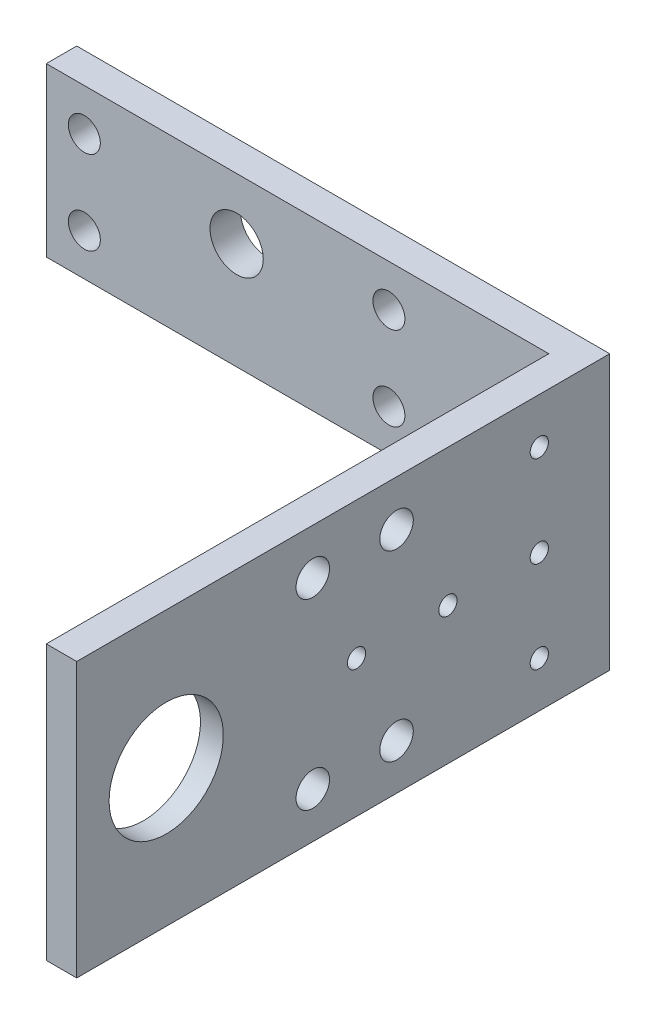
ISO-10303-21;
HEADER;
FILE_DESCRIPTION(('STEP AP214'),'2;1');
FILE_NAME('part.step','',(''),(''),'','','');
FILE_SCHEMA(('AUTOMOTIVE_DESIGN { 1 0 10303 214 1 1 1 1 }'));
ENDSEC;
DATA;
#1=APPLICATION_CONTEXT('core data for automotive mechanical design processes');
#2=APPLICATION_PROTOCOL_DEFINITION('international standard','automotive_design',2000,#1);
#3=PRODUCT_CONTEXT('',#1,'mechanical');
#4=PRODUCT('Part','Part','',(#3));
#5=PRODUCT_RELATED_PRODUCT_CATEGORY('part','',(#4));
#6=PRODUCT_DEFINITION_FORMATION('','',#4);
#7=PRODUCT_DEFINITION_CONTEXT('part definition',#1,'design');
#8=PRODUCT_DEFINITION('design','',#6,#7);
#9=PRODUCT_DEFINITION_SHAPE('','',#8);
#10=(LENGTH_UNIT() NAMED_UNIT(*) SI_UNIT(.MILLI.,.METRE.));
#11=(NAMED_UNIT(*) PLANE_ANGLE_UNIT() SI_UNIT($,.RADIAN.));
#12=(NAMED_UNIT(*) SI_UNIT($,.STERADIAN.) SOLID_ANGLE_UNIT());
#13=UNCERTAINTY_MEASURE_WITH_UNIT(LENGTH_MEASURE(1.E-05),#10,'distance_accuracy_value','');
#14=(GEOMETRIC_REPRESENTATION_CONTEXT(3) GLOBAL_UNCERTAINTY_ASSIGNED_CONTEXT((#13)) GLOBAL_UNIT_ASSIGNED_CONTEXT((#10,
#11,#12)) REPRESENTATION_CONTEXT('',''));
#15=CARTESIAN_POINT('',(0.,0.,0.));
#16=DIRECTION('',(0.,0.,1.));
#17=DIRECTION('',(1.,0.,0.));
#18=AXIS2_PLACEMENT_3D('',#15,#16,#17);
#19=CARTESIAN_POINT('',(35.,18.,23.25));
#20=DIRECTION('',(-1.,0.,0.));
#21=DIRECTION('',(0.,0.,1.));
#22=AXIS2_PLACEMENT_3D('',#19,#20,#21);
#23=CYLINDRICAL_SURFACE('',#22,7.5);
#24=CARTESIAN_POINT('',(35.,18.,23.25));
#25=DIRECTION('',(-1.,0.,0.));
#26=DIRECTION('',(0.,0.,1.));
#27=AXIS2_PLACEMENT_3D('',#24,#25,#26);
#28=CIRCLE('',#27,7.5);
#29=CARTESIAN_POINT('',(35.,18.,30.75));
#30=VERTEX_POINT('',#29);
#31=EDGE_CURVE('E293',#30,#30,#28,.T.);
#32=ORIENTED_EDGE('',*,*,#31,.F.);
#33=EDGE_LOOP('',(#32));
#34=FACE_BOUND('',#33,.T.);
#35=CARTESIAN_POINT('',(32.,18.,23.25));
#36=DIRECTION('',(-1.,0.,0.));
#37=DIRECTION('',(0.,0.,1.));
#38=AXIS2_PLACEMENT_3D('',#35,#36,#37);
#39=CIRCLE('',#38,7.5);
#40=CARTESIAN_POINT('',(32.,18.,30.75));
#41=VERTEX_POINT('',#40);
#42=EDGE_CURVE('E21',#41,#41,#39,.F.);
#43=ORIENTED_EDGE('',*,*,#42,.F.);
#44=EDGE_LOOP('',(#43));
#45=FACE_BOUND('',#44,.T.);
#46=ADVANCED_FACE('F17',(#34,#45),#23,.F.);
#47=CARTESIAN_POINT('',(-35.,36.,-31.));
#48=DIRECTION('',(1.,0.,0.));
#49=DIRECTION('',(0.,0.,-1.));
#50=AXIS2_PLACEMENT_3D('',#47,#48,#49);
#51=PLANE('',#50);
#52=DIRECTION('',(0.,-1.,0.));
#53=VECTOR('',#52,1.);
#54=CARTESIAN_POINT('',(-35.,36.,-35.));
#55=LINE('',#54,#53);
#56=CARTESIAN_POINT('',(-35.,36.,-35.));
#57=VERTEX_POINT('',#56);
#58=CARTESIAN_POINT('',(-35.,14.,-35.));
#59=VERTEX_POINT('',#58);
#60=EDGE_CURVE('E124',#57,#59,#55,.T.);
#61=ORIENTED_EDGE('',*,*,#60,.T.);
#62=DIRECTION('',(0.,0.,-1.));
#63=VECTOR('',#62,1.);
#64=CARTESIAN_POINT('',(-35.,14.,35.));
#65=LINE('',#64,#63);
#66=CARTESIAN_POINT('',(-35.,14.,-31.));
#67=VERTEX_POINT('',#66);
#68=EDGE_CURVE('E170',#67,#59,#65,.T.);
#69=ORIENTED_EDGE('',*,*,#68,.F.);
#70=DIRECTION('',(0.,-1.,0.));
#71=VECTOR('',#70,1.);
#72=CARTESIAN_POINT('',(-35.,36.,-31.));
#73=LINE('',#72,#71);
#74=CARTESIAN_POINT('',(-35.,36.,-31.));
#75=VERTEX_POINT('',#74);
#76=EDGE_CURVE('E27',#75,#67,#73,.T.);
#77=ORIENTED_EDGE('',*,*,#76,.F.);
#78=DIRECTION('',(0.,0.,1.));
#79=VECTOR('',#78,1.);
#80=CARTESIAN_POINT('',(-35.,36.,-31.));
#81=LINE('',#80,#79);
#82=EDGE_CURVE('E143',#57,#75,#81,.T.);
#83=ORIENTED_EDGE('',*,*,#82,.F.);
#84=EDGE_LOOP('',(#61,#69,#77,#83));
#85=FACE_BOUND('',#84,.T.);
#86=ADVANCED_FACE('F19',(#85),#51,.F.);
#87=CARTESIAN_POINT('',(31.,36.,-31.));
#88=DIRECTION('',(0.,0.,-1.));
#89=DIRECTION('',(-1.,0.,0.));
#90=AXIS2_PLACEMENT_3D('',#87,#88,#89);
#91=PLANE('',#90);
#92=CARTESIAN_POINT('',(-10.,28.,-31.));
#93=DIRECTION('',(0.,0.,1.));
#94=DIRECTION('',(1.,0.,0.));
#95=AXIS2_PLACEMENT_3D('',#92,#93,#94);
#96=CIRCLE('',#95,3.5);
#97=CARTESIAN_POINT('',(-6.5,28.,-31.));
#98=VERTEX_POINT('',#97);
#99=EDGE_CURVE('E341',#98,#98,#96,.T.);
#100=ORIENTED_EDGE('',*,*,#99,.F.);
#101=EDGE_LOOP('',(#100));
#102=FACE_BOUND('',#101,.T.);
#103=CARTESIAN_POINT('',(10.,19.5,-31.));
#104=DIRECTION('',(0.,0.,-1.));
#105=DIRECTION('',(-1.,0.,0.));
#106=AXIS2_PLACEMENT_3D('',#103,#104,#105);
#107=CIRCLE('',#106,2.1);
#108=CARTESIAN_POINT('',(7.9,19.5,-31.));
#109=VERTEX_POINT('',#108);
#110=EDGE_CURVE('E194',#109,#109,#107,.T.);
#111=ORIENTED_EDGE('',*,*,#110,.T.);
#112=EDGE_LOOP('',(#111));
#113=FACE_BOUND('',#112,.T.);
#114=CARTESIAN_POINT('',(10.,30.5,-31.));
#115=DIRECTION('',(0.,0.,-1.));
#116=DIRECTION('',(-1.,0.,0.));
#117=AXIS2_PLACEMENT_3D('',#114,#115,#116);
#118=CIRCLE('',#117,2.1);
#119=CARTESIAN_POINT('',(7.9,30.5,-31.));
#120=VERTEX_POINT('',#119);
#121=EDGE_CURVE('E202',#120,#120,#118,.T.);
#122=ORIENTED_EDGE('',*,*,#121,.T.);
#123=EDGE_LOOP('',(#122));
#124=FACE_BOUND('',#123,.T.);
#125=CARTESIAN_POINT('',(-30.,19.5,-31.));
#126=DIRECTION('',(0.,0.,-1.));
#127=DIRECTION('',(-1.,0.,0.));
#128=AXIS2_PLACEMENT_3D('',#125,#126,#127);
#129=CIRCLE('',#128,2.1);
#130=CARTESIAN_POINT('',(-32.1,19.5,-31.));
#131=VERTEX_POINT('',#130);
#132=EDGE_CURVE('E210',#131,#131,#129,.T.);
#133=ORIENTED_EDGE('',*,*,#132,.T.);
#134=EDGE_LOOP('',(#133));
#135=FACE_BOUND('',#134,.T.);
#136=CARTESIAN_POINT('',(-30.,30.5,-31.));
#137=DIRECTION('',(0.,0.,-1.));
#138=DIRECTION('',(-1.,0.,0.));
#139=AXIS2_PLACEMENT_3D('',#136,#137,#138);
#140=CIRCLE('',#139,2.1);
#141=CARTESIAN_POINT('',(-32.1,30.5,-31.));
#142=VERTEX_POINT('',#141);
#143=EDGE_CURVE('E132',#142,#142,#140,.T.);
#144=ORIENTED_EDGE('',*,*,#143,.T.);
#145=EDGE_LOOP('',(#144));
#146=FACE_BOUND('',#145,.T.);
#147=DIRECTION('',(1.,0.,0.));
#148=VECTOR('',#147,1.);
#149=CARTESIAN_POINT('',(31.,14.,-31.));
#150=LINE('',#149,#148);
#151=CARTESIAN_POINT('',(19.,14.,-31.));
#152=VERTEX_POINT('',#151);
#153=EDGE_CURVE('E163',#67,#152,#150,.T.);
#154=ORIENTED_EDGE('',*,*,#153,.T.);
#155=DIRECTION('',(0.581238193719097,-0.813733471206735,0.));
#156=VECTOR('',#155,1.);
#157=CARTESIAN_POINT('',(12.6486486486487,22.8918918918919,-31.));
#158=LINE('',#157,#156);
#159=CARTESIAN_POINT('',(29.,0.,-31.));
#160=VERTEX_POINT('',#159);
#161=EDGE_CURVE('E181',#152,#160,#158,.T.);
#162=ORIENTED_EDGE('',*,*,#161,.T.);
#163=DIRECTION('',(1.,0.,0.));
#164=VECTOR('',#163,1.);
#165=CARTESIAN_POINT('',(31.,0.,-31.));
#166=LINE('',#165,#164);
#167=CARTESIAN_POINT('',(31.,0.,-31.));
#168=VERTEX_POINT('',#167);
#169=EDGE_CURVE('E128',#160,#168,#166,.T.);
#170=ORIENTED_EDGE('',*,*,#169,.T.);
#171=DIRECTION('',(0.,-1.,0.));
#172=VECTOR('',#171,1.);
#173=CARTESIAN_POINT('',(31.,36.,-31.));
#174=LINE('',#173,#172);
#175=CARTESIAN_POINT('',(31.,36.,-31.));
#176=VERTEX_POINT('',#175);
#177=EDGE_CURVE('E151',#176,#168,#174,.T.);
#178=ORIENTED_EDGE('',*,*,#177,.F.);
#179=DIRECTION('',(1.,0.,0.));
#180=VECTOR('',#179,1.);
#181=CARTESIAN_POINT('',(-31.,36.,-31.));
#182=LINE('',#181,#180);
#183=EDGE_CURVE('E87',#75,#176,#182,.T.);
#184=ORIENTED_EDGE('',*,*,#183,.F.);
#185=ORIENTED_EDGE('',*,*,#76,.T.);
#186=EDGE_LOOP('',(#154,#162,#170,#178,#184,#185));
#187=FACE_BOUND('',#186,.T.);
#188=ADVANCED_FACE('F159',(#102,#113,#124,#135,#146,#187),#91,.F.);
#189=CARTESIAN_POINT('',(31.,36.,31.));
#190=DIRECTION('',(1.,0.,0.));
#191=DIRECTION('',(0.,0.,-1.));
#192=AXIS2_PLACEMENT_3D('',#189,#190,#191);
#193=PLANE('',#192);
#194=CARTESIAN_POINT('',(31.,18.,23.25));
#195=DIRECTION('',(-1.,0.,0.));
#196=DIRECTION('',(0.,0.,1.));
#197=AXIS2_PLACEMENT_3D('',#194,#195,#196);
#198=CIRCLE('',#197,9.);
#199=CARTESIAN_POINT('',(31.,18.,32.25));
#200=VERTEX_POINT('',#199);
#201=EDGE_CURVE('E348',#200,#200,#198,.T.);
#202=ORIENTED_EDGE('',*,*,#201,.F.);
#203=EDGE_LOOP('',(#202));
#204=FACE_BOUND('',#203,.T.);
#205=CARTESIAN_POINT('',(31.,6.,-25.75));
#206=DIRECTION('',(1.,0.,0.));
#207=DIRECTION('',(0.,0.,-1.));
#208=AXIS2_PLACEMENT_3D('',#205,#206,#207);
#209=CIRCLE('',#208,1.2);
#210=CARTESIAN_POINT('',(31.,6.,-26.95));
#211=VERTEX_POINT('',#210);
#212=EDGE_CURVE('E332',#211,#211,#209,.T.);
#213=ORIENTED_EDGE('',*,*,#212,.T.);
#214=EDGE_LOOP('',(#213));
#215=FACE_BOUND('',#214,.T.);
#216=CARTESIAN_POINT('',(31.,30.,-25.75));
#217=DIRECTION('',(1.,0.,0.));
#218=DIRECTION('',(0.,0.,-1.));
#219=AXIS2_PLACEMENT_3D('',#216,#217,#218);
#220=CIRCLE('',#219,1.2);
#221=CARTESIAN_POINT('',(31.,30.,-26.95));
#222=VERTEX_POINT('',#221);
#223=EDGE_CURVE('E324',#222,#222,#220,.T.);
#224=ORIENTED_EDGE('',*,*,#223,.T.);
#225=EDGE_LOOP('',(#224));
#226=FACE_BOUND('',#225,.T.);
#227=CARTESIAN_POINT('',(31.,18.,-25.75));
#228=DIRECTION('',(1.,0.,0.));
#229=DIRECTION('',(0.,0.,-1.));
#230=AXIS2_PLACEMENT_3D('',#227,#228,#229);
#231=CIRCLE('',#230,1.2);
#232=CARTESIAN_POINT('',(31.,18.,-26.95));
#233=VERTEX_POINT('',#232);
#234=EDGE_CURVE('E316',#233,#233,#231,.T.);
#235=ORIENTED_EDGE('',*,*,#234,.T.);
#236=EDGE_LOOP('',(#235));
#237=FACE_BOUND('',#236,.T.);
#238=CARTESIAN_POINT('',(31.,18.,-13.75));
#239=DIRECTION('',(1.,0.,0.));
#240=DIRECTION('',(0.,0.,-1.));
#241=AXIS2_PLACEMENT_3D('',#238,#239,#240);
#242=CIRCLE('',#241,1.2);
#243=CARTESIAN_POINT('',(31.,18.,-14.95));
#244=VERTEX_POINT('',#243);
#245=EDGE_CURVE('E308',#244,#244,#242,.T.);
#246=ORIENTED_EDGE('',*,*,#245,.T.);
#247=EDGE_LOOP('',(#246));
#248=FACE_BOUND('',#247,.T.);
#249=CARTESIAN_POINT('',(31.,18.,-1.75));
#250=DIRECTION('',(1.,0.,0.));
#251=DIRECTION('',(0.,0.,-1.));
#252=AXIS2_PLACEMENT_3D('',#249,#250,#251);
#253=CIRCLE('',#252,1.2);
#254=CARTESIAN_POINT('',(31.,18.,-2.95));
#255=VERTEX_POINT('',#254);
#256=EDGE_CURVE('E300',#255,#255,#253,.T.);
#257=ORIENTED_EDGE('',*,*,#256,.T.);
#258=EDGE_LOOP('',(#257));
#259=FACE_BOUND('',#258,.T.);
#260=CARTESIAN_POINT('',(31.,6.,4.));
#261=DIRECTION('',(-1.,0.,0.));
#262=DIRECTION('',(0.,0.,1.));
#263=AXIS2_PLACEMENT_3D('',#260,#261,#262);
#264=CIRCLE('',#263,2.2);
#265=CARTESIAN_POINT('',(31.,6.,6.2));
#266=VERTEX_POINT('',#265);
#267=EDGE_CURVE('E289',#266,#266,#264,.T.);
#268=ORIENTED_EDGE('',*,*,#267,.F.);
#269=EDGE_LOOP('',(#268));
#270=FACE_BOUND('',#269,.T.);
#271=CARTESIAN_POINT('',(31.,6.,-7.));
#272=DIRECTION('',(-1.,0.,0.));
#273=DIRECTION('',(0.,0.,1.));
#274=AXIS2_PLACEMENT_3D('',#271,#272,#273);
#275=CIRCLE('',#274,2.2);
#276=CARTESIAN_POINT('',(31.,6.,-4.8));
#277=VERTEX_POINT('',#276);
#278=EDGE_CURVE('E281',#277,#277,#275,.T.);
#279=ORIENTED_EDGE('',*,*,#278,.F.);
#280=EDGE_LOOP('',(#279));
#281=FACE_BOUND('',#280,.T.);
#282=CARTESIAN_POINT('',(31.,30.,4.));
#283=DIRECTION('',(-1.,0.,0.));
#284=DIRECTION('',(0.,0.,1.));
#285=AXIS2_PLACEMENT_3D('',#282,#283,#284);
#286=CIRCLE('',#285,2.2);
#287=CARTESIAN_POINT('',(31.,30.,6.2));
#288=VERTEX_POINT('',#287);
#289=EDGE_CURVE('E273',#288,#288,#286,.T.);
#290=ORIENTED_EDGE('',*,*,#289,.F.);
#291=EDGE_LOOP('',(#290));
#292=FACE_BOUND('',#291,.T.);
#293=CARTESIAN_POINT('',(31.,30.,-7.));
#294=DIRECTION('',(-1.,0.,0.));
#295=DIRECTION('',(0.,0.,1.));
#296=AXIS2_PLACEMENT_3D('',#293,#294,#295);
#297=CIRCLE('',#296,2.2);
#298=CARTESIAN_POINT('',(31.,30.,-4.8));
#299=VERTEX_POINT('',#298);
#300=EDGE_CURVE('E266',#299,#299,#297,.T.);
#301=ORIENTED_EDGE('',*,*,#300,.F.);
#302=EDGE_LOOP('',(#301));
#303=FACE_BOUND('',#302,.T.);
#304=DIRECTION('',(0.,0.,1.));
#305=VECTOR('',#304,1.);
#306=CARTESIAN_POINT('',(31.,0.,31.));
#307=LINE('',#306,#305);
#308=CARTESIAN_POINT('',(31.,0.,35.));
#309=VERTEX_POINT('',#308);
#310=EDGE_CURVE('E131',#168,#309,#307,.T.);
#311=ORIENTED_EDGE('',*,*,#310,.T.);
#312=DIRECTION('',(0.,-1.,0.));
#313=VECTOR('',#312,1.);
#314=CARTESIAN_POINT('',(31.,36.,35.));
#315=LINE('',#314,#313);
#316=CARTESIAN_POINT('',(31.,36.,35.));
#317=VERTEX_POINT('',#316);
#318=EDGE_CURVE('E116',#317,#309,#315,.T.);
#319=ORIENTED_EDGE('',*,*,#318,.F.);
#320=DIRECTION('',(0.,0.,1.));
#321=VECTOR('',#320,1.);
#322=CARTESIAN_POINT('',(31.,36.,31.));
#323=LINE('',#322,#321);
#324=EDGE_CURVE('E105',#176,#317,#323,.T.);
#325=ORIENTED_EDGE('',*,*,#324,.F.);
#326=ORIENTED_EDGE('',*,*,#177,.T.);
#327=EDGE_LOOP('',(#311,#319,#325,#326));
#328=FACE_BOUND('',#327,.T.);
#329=ADVANCED_FACE('F250',(#204,#215,#226,#237,#248,#259,#270,#281,#292,#303,#328),#193,.F.);
#330=CARTESIAN_POINT('',(31.,36.,35.));
#331=DIRECTION('',(0.,0.,-1.));
#332=DIRECTION('',(-1.,0.,0.));
#333=AXIS2_PLACEMENT_3D('',#330,#331,#332);
#334=PLANE('',#333);
#335=DIRECTION('',(1.,0.,0.));
#336=VECTOR('',#335,1.);
#337=CARTESIAN_POINT('',(31.,0.,35.));
#338=LINE('',#337,#336);
#339=CARTESIAN_POINT('',(35.,0.,35.));
#340=VERTEX_POINT('',#339);
#341=EDGE_CURVE('E114',#309,#340,#338,.T.);
#342=ORIENTED_EDGE('',*,*,#341,.T.);
#343=DIRECTION('',(0.,-1.,0.));
#344=VECTOR('',#343,1.);
#345=CARTESIAN_POINT('',(35.,36.,35.));
#346=LINE('',#345,#344);
#347=CARTESIAN_POINT('',(35.,36.,35.));
#348=VERTEX_POINT('',#347);
#349=EDGE_CURVE('E111',#348,#340,#346,.T.);
#350=ORIENTED_EDGE('',*,*,#349,.F.);
#351=DIRECTION('',(1.,0.,0.));
#352=VECTOR('',#351,1.);
#353=CARTESIAN_POINT('',(31.,36.,35.));
#354=LINE('',#353,#352);
#355=EDGE_CURVE('E99',#317,#348,#354,.T.);
#356=ORIENTED_EDGE('',*,*,#355,.F.);
#357=ORIENTED_EDGE('',*,*,#318,.T.);
#358=EDGE_LOOP('',(#342,#350,#356,#357));
#359=FACE_BOUND('',#358,.T.);
#360=ADVANCED_FACE('F112',(#359),#334,.F.);
#361=CARTESIAN_POINT('',(35.,36.,35.));
#362=DIRECTION('',(-1.,0.,0.));
#363=DIRECTION('',(0.,0.,1.));
#364=AXIS2_PLACEMENT_3D('',#361,#362,#363);
#365=PLANE('',#364);
#366=CARTESIAN_POINT('',(35.,6.,-25.75));
#367=DIRECTION('',(1.,0.,0.));
#368=DIRECTION('',(0.,0.,-1.));
#369=AXIS2_PLACEMENT_3D('',#366,#367,#368);
#370=CIRCLE('',#369,1.2);
#371=CARTESIAN_POINT('',(35.,6.,-26.95));
#372=VERTEX_POINT('',#371);
#373=EDGE_CURVE('E336',#372,#372,#370,.T.);
#374=ORIENTED_EDGE('',*,*,#373,.F.);
#375=EDGE_LOOP('',(#374));
#376=FACE_BOUND('',#375,.T.);
#377=CARTESIAN_POINT('',(35.,30.,-25.75));
#378=DIRECTION('',(1.,0.,0.));
#379=DIRECTION('',(0.,0.,-1.));
#380=AXIS2_PLACEMENT_3D('',#377,#378,#379);
#381=CIRCLE('',#380,1.2);
#382=CARTESIAN_POINT('',(35.,30.,-26.95));
#383=VERTEX_POINT('',#382);
#384=EDGE_CURVE('E328',#383,#383,#381,.T.);
#385=ORIENTED_EDGE('',*,*,#384,.F.);
#386=EDGE_LOOP('',(#385));
#387=FACE_BOUND('',#386,.T.);
#388=CARTESIAN_POINT('',(35.,18.,-25.75));
#389=DIRECTION('',(1.,0.,0.));
#390=DIRECTION('',(0.,0.,-1.));
#391=AXIS2_PLACEMENT_3D('',#388,#389,#390);
#392=CIRCLE('',#391,1.2);
#393=CARTESIAN_POINT('',(35.,18.,-26.95));
#394=VERTEX_POINT('',#393);
#395=EDGE_CURVE('E320',#394,#394,#392,.T.);
#396=ORIENTED_EDGE('',*,*,#395,.F.);
#397=EDGE_LOOP('',(#396));
#398=FACE_BOUND('',#397,.T.);
#399=CARTESIAN_POINT('',(35.,18.,-13.75));
#400=DIRECTION('',(1.,0.,0.));
#401=DIRECTION('',(0.,0.,-1.));
#402=AXIS2_PLACEMENT_3D('',#399,#400,#401);
#403=CIRCLE('',#402,1.2);
#404=CARTESIAN_POINT('',(35.,18.,-14.95));
#405=VERTEX_POINT('',#404);
#406=EDGE_CURVE('E312',#405,#405,#403,.T.);
#407=ORIENTED_EDGE('',*,*,#406,.F.);
#408=EDGE_LOOP('',(#407));
#409=FACE_BOUND('',#408,.T.);
#410=CARTESIAN_POINT('',(35.,18.,-1.75));
#411=DIRECTION('',(1.,0.,0.));
#412=DIRECTION('',(0.,0.,-1.));
#413=AXIS2_PLACEMENT_3D('',#410,#411,#412);
#414=CIRCLE('',#413,1.2);
#415=CARTESIAN_POINT('',(35.,18.,-2.95));
#416=VERTEX_POINT('',#415);
#417=EDGE_CURVE('E304',#416,#416,#414,.T.);
#418=ORIENTED_EDGE('',*,*,#417,.F.);
#419=EDGE_LOOP('',(#418));
#420=FACE_BOUND('',#419,.T.);
#421=ORIENTED_EDGE('',*,*,#31,.T.);
#422=EDGE_LOOP('',(#421));
#423=FACE_BOUND('',#422,.T.);
#424=CARTESIAN_POINT('',(35.,6.,4.));
#425=DIRECTION('',(-1.,0.,0.));
#426=DIRECTION('',(0.,0.,1.));
#427=AXIS2_PLACEMENT_3D('',#424,#425,#426);
#428=CIRCLE('',#427,2.2);
#429=CARTESIAN_POINT('',(35.,6.,6.2));
#430=VERTEX_POINT('',#429);
#431=EDGE_CURVE('E285',#430,#430,#428,.T.);
#432=ORIENTED_EDGE('',*,*,#431,.T.);
#433=EDGE_LOOP('',(#432));
#434=FACE_BOUND('',#433,.T.);
#435=CARTESIAN_POINT('',(35.,6.,-7.));
#436=DIRECTION('',(-1.,0.,0.));
#437=DIRECTION('',(0.,0.,1.));
#438=AXIS2_PLACEMENT_3D('',#435,#436,#437);
#439=CIRCLE('',#438,2.2);
#440=CARTESIAN_POINT('',(35.,6.,-4.8));
#441=VERTEX_POINT('',#440);
#442=EDGE_CURVE('E277',#441,#441,#439,.T.);
#443=ORIENTED_EDGE('',*,*,#442,.T.);
#444=EDGE_LOOP('',(#443));
#445=FACE_BOUND('',#444,.T.);
#446=CARTESIAN_POINT('',(35.,30.,4.));
#447=DIRECTION('',(-1.,0.,0.));
#448=DIRECTION('',(0.,0.,1.));
#449=AXIS2_PLACEMENT_3D('',#446,#447,#448);
#450=CIRCLE('',#449,2.2);
#451=CARTESIAN_POINT('',(35.,30.,6.2));
#452=VERTEX_POINT('',#451);
#453=EDGE_CURVE('E271',#452,#452,#450,.T.);
#454=ORIENTED_EDGE('',*,*,#453,.T.);
#455=EDGE_LOOP('',(#454));
#456=FACE_BOUND('',#455,.T.);
#457=CARTESIAN_POINT('',(35.,30.,-7.));
#458=DIRECTION('',(-1.,0.,0.));
#459=DIRECTION('',(0.,0.,1.));
#460=AXIS2_PLACEMENT_3D('',#457,#458,#459);
#461=CIRCLE('',#460,2.2);
#462=CARTESIAN_POINT('',(35.,30.,-4.8));
#463=VERTEX_POINT('',#462);
#464=EDGE_CURVE('E261',#463,#463,#461,.T.);
#465=ORIENTED_EDGE('',*,*,#464,.T.);
#466=EDGE_LOOP('',(#465));
#467=FACE_BOUND('',#466,.T.);
#468=DIRECTION('',(0.,0.,-1.));
#469=VECTOR('',#468,1.);
#470=CARTESIAN_POINT('',(35.,0.,35.));
#471=LINE('',#470,#469);
#472=CARTESIAN_POINT('',(35.,0.,-35.));
#473=VERTEX_POINT('',#472);
#474=EDGE_CURVE('E76',#340,#473,#471,.T.);
#475=ORIENTED_EDGE('',*,*,#474,.T.);
#476=DIRECTION('',(0.,-1.,0.));
#477=VECTOR('',#476,1.);
#478=CARTESIAN_POINT('',(35.,36.,-35.));
#479=LINE('',#478,#477);
#480=CARTESIAN_POINT('',(35.,36.,-35.));
#481=VERTEX_POINT('',#480);
#482=EDGE_CURVE('E117',#481,#473,#479,.T.);
#483=ORIENTED_EDGE('',*,*,#482,.F.);
#484=DIRECTION('',(0.,0.,-1.));
#485=VECTOR('',#484,1.);
#486=CARTESIAN_POINT('',(35.,36.,35.));
#487=LINE('',#486,#485);
#488=EDGE_CURVE('E103',#348,#481,#487,.T.);
#489=ORIENTED_EDGE('',*,*,#488,.F.);
#490=ORIENTED_EDGE('',*,*,#349,.T.);
#491=EDGE_LOOP('',(#475,#483,#489,#490));
#492=FACE_BOUND('',#491,.T.);
#493=ADVANCED_FACE('F119',(#376,#387,#398,#409,#420,#423,#434,#445,#456,#467,#492),#365,.F.);
#494=CARTESIAN_POINT('',(35.,36.,-35.));
#495=DIRECTION('',(0.,0.,1.));
#496=DIRECTION('',(1.,0.,0.));
#497=AXIS2_PLACEMENT_3D('',#494,#495,#496);
#498=PLANE('',#497);
#499=CARTESIAN_POINT('',(-10.,28.,-35.));
#500=DIRECTION('',(0.,0.,1.));
#501=DIRECTION('',(1.,0.,0.));
#502=AXIS2_PLACEMENT_3D('',#499,#500,#501);
#503=CIRCLE('',#502,3.5);
#504=CARTESIAN_POINT('',(-6.5,28.,-35.));
#505=VERTEX_POINT('',#504);
#506=EDGE_CURVE('E340',#505,#505,#503,.T.);
#507=ORIENTED_EDGE('',*,*,#506,.T.);
#508=EDGE_LOOP('',(#507));
#509=FACE_BOUND('',#508,.T.);
#510=CARTESIAN_POINT('',(10.,19.5,-35.));
#511=DIRECTION('',(0.,0.,-1.));
#512=DIRECTION('',(-1.,0.,0.));
#513=AXIS2_PLACEMENT_3D('',#510,#511,#512);
#514=CIRCLE('',#513,2.1);
#515=CARTESIAN_POINT('',(7.9,19.5,-35.));
#516=VERTEX_POINT('',#515);
#517=EDGE_CURVE('E190',#516,#516,#514,.T.);
#518=ORIENTED_EDGE('',*,*,#517,.F.);
#519=EDGE_LOOP('',(#518));
#520=FACE_BOUND('',#519,.T.);
#521=CARTESIAN_POINT('',(10.,30.5,-35.));
#522=DIRECTION('',(0.,0.,-1.));
#523=DIRECTION('',(-1.,0.,0.));
#524=AXIS2_PLACEMENT_3D('',#521,#522,#523);
#525=CIRCLE('',#524,2.1);
#526=CARTESIAN_POINT('',(7.9,30.5,-35.));
#527=VERTEX_POINT('',#526);
#528=EDGE_CURVE('E198',#527,#527,#525,.T.);
#529=ORIENTED_EDGE('',*,*,#528,.F.);
#530=EDGE_LOOP('',(#529));
#531=FACE_BOUND('',#530,.T.);
#532=CARTESIAN_POINT('',(-30.,19.5,-35.));
#533=DIRECTION('',(0.,0.,-1.));
#534=DIRECTION('',(-1.,0.,0.));
#535=AXIS2_PLACEMENT_3D('',#532,#533,#534);
#536=CIRCLE('',#535,2.1);
#537=CARTESIAN_POINT('',(-32.1,19.5,-35.));
#538=VERTEX_POINT('',#537);
#539=EDGE_CURVE('E206',#538,#538,#536,.T.);
#540=ORIENTED_EDGE('',*,*,#539,.F.);
#541=EDGE_LOOP('',(#540));
#542=FACE_BOUND('',#541,.T.);
#543=CARTESIAN_POINT('',(-30.,30.5,-35.));
#544=DIRECTION('',(0.,0.,-1.));
#545=DIRECTION('',(-1.,0.,0.));
#546=AXIS2_PLACEMENT_3D('',#543,#544,#545);
#547=CIRCLE('',#546,2.1);
#548=CARTESIAN_POINT('',(-32.1,30.5,-35.));
#549=VERTEX_POINT('',#548);
#550=EDGE_CURVE('E214',#549,#549,#547,.T.);
#551=ORIENTED_EDGE('',*,*,#550,.F.);
#552=EDGE_LOOP('',(#551));
#553=FACE_BOUND('',#552,.T.);
#554=DIRECTION('',(-1.,0.,0.));
#555=VECTOR('',#554,1.);
#556=CARTESIAN_POINT('',(35.,0.,-35.));
#557=LINE('',#556,#555);
#558=CARTESIAN_POINT('',(29.,0.,-35.));
#559=VERTEX_POINT('',#558);
#560=EDGE_CURVE('E139',#473,#559,#557,.T.);
#561=ORIENTED_EDGE('',*,*,#560,.T.);
#562=DIRECTION('',(0.581238193719097,-0.813733471206735,0.));
#563=VECTOR('',#562,1.);
#564=CARTESIAN_POINT('',(19.,14.,-35.));
#565=LINE('',#564,#563);
#566=CARTESIAN_POINT('',(19.,14.,-35.));
#567=VERTEX_POINT('',#566);
#568=EDGE_CURVE('E38',#567,#559,#565,.T.);
#569=ORIENTED_EDGE('',*,*,#568,.F.);
#570=DIRECTION('',(1.,0.,0.));
#571=VECTOR('',#570,1.);
#572=CARTESIAN_POINT('',(-35.,14.,-35.));
#573=LINE('',#572,#571);
#574=EDGE_CURVE('E183',#59,#567,#573,.T.);
#575=ORIENTED_EDGE('',*,*,#574,.F.);
#576=ORIENTED_EDGE('',*,*,#60,.F.);
#577=DIRECTION('',(-1.,0.,0.));
#578=VECTOR('',#577,1.);
#579=CARTESIAN_POINT('',(35.,36.,-35.));
#580=LINE('',#579,#578);
#581=EDGE_CURVE('E48',#481,#57,#580,.T.);
#582=ORIENTED_EDGE('',*,*,#581,.F.);
#583=ORIENTED_EDGE('',*,*,#482,.T.);
#584=EDGE_LOOP('',(#561,#569,#575,#576,#582,#583));
#585=FACE_BOUND('',#584,.T.);
#586=ADVANCED_FACE('F255',(#509,#520,#531,#542,#553,#585),#498,.F.);
#587=CARTESIAN_POINT('',(-35.,36.,-35.));
#588=DIRECTION('',(0.,1.,0.));
#589=DIRECTION('',(0.,0.,1.));
#590=AXIS2_PLACEMENT_3D('',#587,#588,#589);
#591=PLANE('',#590);
#592=ORIENTED_EDGE('',*,*,#82,.T.);
#593=ORIENTED_EDGE('',*,*,#183,.T.);
#594=ORIENTED_EDGE('',*,*,#324,.T.);
#595=ORIENTED_EDGE('',*,*,#355,.T.);
#596=ORIENTED_EDGE('',*,*,#488,.T.);
#597=ORIENTED_EDGE('',*,*,#581,.T.);
#598=EDGE_LOOP('',(#592,#593,#594,#595,#596,#597));
#599=FACE_BOUND('',#598,.T.);
#600=ADVANCED_FACE('F101',(#599),#591,.T.);
#601=CARTESIAN_POINT('',(-35.,0.,-35.));
#602=DIRECTION('',(0.,1.,0.));
#603=DIRECTION('',(0.,0.,1.));
#604=AXIS2_PLACEMENT_3D('',#601,#602,#603);
#605=PLANE('',#604);
#606=ORIENTED_EDGE('',*,*,#169,.F.);
#607=DIRECTION('',(0.,0.,-1.));
#608=VECTOR('',#607,1.);
#609=CARTESIAN_POINT('',(29.,0.,-35.));
#610=LINE('',#609,#608);
#611=EDGE_CURVE('E11',#160,#559,#610,.T.);
#612=ORIENTED_EDGE('',*,*,#611,.T.);
#613=ORIENTED_EDGE('',*,*,#560,.F.);
#614=ORIENTED_EDGE('',*,*,#474,.F.);
#615=ORIENTED_EDGE('',*,*,#341,.F.);
#616=ORIENTED_EDGE('',*,*,#310,.F.);
#617=EDGE_LOOP('',(#606,#612,#613,#614,#615,#616));
#618=FACE_BOUND('',#617,.T.);
#619=ADVANCED_FACE('F252',(#618),#605,.F.);
#620=CARTESIAN_POINT('',(-30.,30.5,35.));
#621=DIRECTION('',(0.,0.,-1.));
#622=DIRECTION('',(-1.,0.,0.));
#623=AXIS2_PLACEMENT_3D('',#620,#621,#622);
#624=CYLINDRICAL_SURFACE('',#623,2.1);
#625=ORIENTED_EDGE('',*,*,#550,.T.);
#626=EDGE_LOOP('',(#625));
#627=FACE_BOUND('',#626,.T.);
#628=ORIENTED_EDGE('',*,*,#143,.F.);
#629=EDGE_LOOP('',(#628));
#630=FACE_BOUND('',#629,.T.);
#631=ADVANCED_FACE('F410',(#627,#630),#624,.F.);
#632=CARTESIAN_POINT('',(-30.,19.5,35.));
#633=DIRECTION('',(0.,0.,-1.));
#634=DIRECTION('',(-1.,0.,0.));
#635=AXIS2_PLACEMENT_3D('',#632,#633,#634);
#636=CYLINDRICAL_SURFACE('',#635,2.1);
#637=ORIENTED_EDGE('',*,*,#539,.T.);
#638=EDGE_LOOP('',(#637));
#639=FACE_BOUND('',#638,.T.);
#640=ORIENTED_EDGE('',*,*,#132,.F.);
#641=EDGE_LOOP('',(#640));
#642=FACE_BOUND('',#641,.T.);
#643=ADVANCED_FACE('F406',(#639,#642),#636,.F.);
#644=CARTESIAN_POINT('',(10.,30.5,35.));
#645=DIRECTION('',(0.,0.,-1.));
#646=DIRECTION('',(-1.,0.,0.));
#647=AXIS2_PLACEMENT_3D('',#644,#645,#646);
#648=CYLINDRICAL_SURFACE('',#647,2.1);
#649=ORIENTED_EDGE('',*,*,#528,.T.);
#650=EDGE_LOOP('',(#649));
#651=FACE_BOUND('',#650,.T.);
#652=ORIENTED_EDGE('',*,*,#121,.F.);
#653=EDGE_LOOP('',(#652));
#654=FACE_BOUND('',#653,.T.);
#655=ADVANCED_FACE('F402',(#651,#654),#648,.F.);
#656=CARTESIAN_POINT('',(10.,19.5,35.));
#657=DIRECTION('',(0.,0.,-1.));
#658=DIRECTION('',(-1.,0.,0.));
#659=AXIS2_PLACEMENT_3D('',#656,#657,#658);
#660=CYLINDRICAL_SURFACE('',#659,2.1);
#661=ORIENTED_EDGE('',*,*,#517,.T.);
#662=EDGE_LOOP('',(#661));
#663=FACE_BOUND('',#662,.T.);
#664=ORIENTED_EDGE('',*,*,#110,.F.);
#665=EDGE_LOOP('',(#664));
#666=FACE_BOUND('',#665,.T.);
#667=ADVANCED_FACE('F399',(#663,#666),#660,.F.);
#668=CARTESIAN_POINT('',(-35.,14.,35.));
#669=DIRECTION('',(0.,1.,0.));
#670=DIRECTION('',(-1.,0.,0.));
#671=AXIS2_PLACEMENT_3D('',#668,#669,#670);
#672=PLANE('',#671);
#673=ORIENTED_EDGE('',*,*,#68,.T.);
#674=ORIENTED_EDGE('',*,*,#574,.T.);
#675=DIRECTION('',(0.,0.,-1.));
#676=VECTOR('',#675,1.);
#677=CARTESIAN_POINT('',(19.,14.,35.));
#678=LINE('',#677,#676);
#679=EDGE_CURVE('E176',#152,#567,#678,.T.);
#680=ORIENTED_EDGE('',*,*,#679,.F.);
#681=ORIENTED_EDGE('',*,*,#153,.F.);
#682=EDGE_LOOP('',(#673,#674,#680,#681));
#683=FACE_BOUND('',#682,.T.);
#684=ADVANCED_FACE('F396',(#683),#672,.F.);
#685=CARTESIAN_POINT('',(19.,14.,35.));
#686=DIRECTION('',(0.813733471206735,0.581238193719097,0.));
#687=DIRECTION('',(-0.581238193719097,0.813733471206735,0.));
#688=AXIS2_PLACEMENT_3D('',#685,#686,#687);
#689=PLANE('',#688);
#690=ORIENTED_EDGE('',*,*,#679,.T.);
#691=ORIENTED_EDGE('',*,*,#568,.T.);
#692=ORIENTED_EDGE('',*,*,#611,.F.);
#693=ORIENTED_EDGE('',*,*,#161,.F.);
#694=EDGE_LOOP('',(#690,#691,#692,#693));
#695=FACE_BOUND('',#694,.T.);
#696=ADVANCED_FACE('F392',(#695),#689,.F.);
#697=CARTESIAN_POINT('',(35.,30.,-7.));
#698=DIRECTION('',(-1.,0.,0.));
#699=DIRECTION('',(0.,0.,1.));
#700=AXIS2_PLACEMENT_3D('',#697,#698,#699);
#701=CYLINDRICAL_SURFACE('',#700,2.2);
#702=ORIENTED_EDGE('',*,*,#464,.F.);
#703=EDGE_LOOP('',(#702));
#704=FACE_BOUND('',#703,.T.);
#705=ORIENTED_EDGE('',*,*,#300,.T.);
#706=EDGE_LOOP('',(#705));
#707=FACE_BOUND('',#706,.T.);
#708=ADVANCED_FACE('F388',(#704,#707),#701,.F.);
#709=CARTESIAN_POINT('',(35.,30.,4.));
#710=DIRECTION('',(-1.,0.,0.));
#711=DIRECTION('',(0.,0.,1.));
#712=AXIS2_PLACEMENT_3D('',#709,#710,#711);
#713=CYLINDRICAL_SURFACE('',#712,2.2);
#714=ORIENTED_EDGE('',*,*,#453,.F.);
#715=EDGE_LOOP('',(#714));
#716=FACE_BOUND('',#715,.T.);
#717=ORIENTED_EDGE('',*,*,#289,.T.);
#718=EDGE_LOOP('',(#717));
#719=FACE_BOUND('',#718,.T.);
#720=ADVANCED_FACE('F384',(#716,#719),#713,.F.);
#721=CARTESIAN_POINT('',(35.,6.,-7.));
#722=DIRECTION('',(-1.,0.,0.));
#723=DIRECTION('',(0.,0.,1.));
#724=AXIS2_PLACEMENT_3D('',#721,#722,#723);
#725=CYLINDRICAL_SURFACE('',#724,2.2);
#726=ORIENTED_EDGE('',*,*,#442,.F.);
#727=EDGE_LOOP('',(#726));
#728=FACE_BOUND('',#727,.T.);
#729=ORIENTED_EDGE('',*,*,#278,.T.);
#730=EDGE_LOOP('',(#729));
#731=FACE_BOUND('',#730,.T.);
#732=ADVANCED_FACE('F380',(#728,#731),#725,.F.);
#733=CARTESIAN_POINT('',(35.,6.,4.));
#734=DIRECTION('',(-1.,0.,0.));
#735=DIRECTION('',(0.,0.,1.));
#736=AXIS2_PLACEMENT_3D('',#733,#734,#735);
#737=CYLINDRICAL_SURFACE('',#736,2.2);
#738=ORIENTED_EDGE('',*,*,#431,.F.);
#739=EDGE_LOOP('',(#738));
#740=FACE_BOUND('',#739,.T.);
#741=ORIENTED_EDGE('',*,*,#267,.T.);
#742=EDGE_LOOP('',(#741));
#743=FACE_BOUND('',#742,.T.);
#744=ADVANCED_FACE('F377',(#740,#743),#737,.F.);
#745=CARTESIAN_POINT('',(-35.,18.,-1.75));
#746=DIRECTION('',(1.,0.,0.));
#747=DIRECTION('',(0.,0.,-1.));
#748=AXIS2_PLACEMENT_3D('',#745,#746,#747);
#749=CYLINDRICAL_SURFACE('',#748,1.2);
#750=ORIENTED_EDGE('',*,*,#417,.T.);
#751=EDGE_LOOP('',(#750));
#752=FACE_BOUND('',#751,.T.);
#753=ORIENTED_EDGE('',*,*,#256,.F.);
#754=EDGE_LOOP('',(#753));
#755=FACE_BOUND('',#754,.T.);
#756=ADVANCED_FACE('F375',(#752,#755),#749,.F.);
#757=CARTESIAN_POINT('',(-35.,18.,-13.75));
#758=DIRECTION('',(1.,0.,0.));
#759=DIRECTION('',(0.,0.,-1.));
#760=AXIS2_PLACEMENT_3D('',#757,#758,#759);
#761=CYLINDRICAL_SURFACE('',#760,1.2);
#762=ORIENTED_EDGE('',*,*,#406,.T.);
#763=EDGE_LOOP('',(#762));
#764=FACE_BOUND('',#763,.T.);
#765=ORIENTED_EDGE('',*,*,#245,.F.);
#766=EDGE_LOOP('',(#765));
#767=FACE_BOUND('',#766,.T.);
#768=ADVANCED_FACE('F469',(#764,#767),#761,.F.);
#769=CARTESIAN_POINT('',(-35.,18.,-25.75));
#770=DIRECTION('',(1.,0.,0.));
#771=DIRECTION('',(0.,0.,-1.));
#772=AXIS2_PLACEMENT_3D('',#769,#770,#771);
#773=CYLINDRICAL_SURFACE('',#772,1.2);
#774=ORIENTED_EDGE('',*,*,#395,.T.);
#775=EDGE_LOOP('',(#774));
#776=FACE_BOUND('',#775,.T.);
#777=ORIENTED_EDGE('',*,*,#234,.F.);
#778=EDGE_LOOP('',(#777));
#779=FACE_BOUND('',#778,.T.);
#780=ADVANCED_FACE('F466',(#776,#779),#773,.F.);
#781=CARTESIAN_POINT('',(-35.,30.,-25.75));
#782=DIRECTION('',(1.,0.,0.));
#783=DIRECTION('',(0.,0.,-1.));
#784=AXIS2_PLACEMENT_3D('',#781,#782,#783);
#785=CYLINDRICAL_SURFACE('',#784,1.2);
#786=ORIENTED_EDGE('',*,*,#384,.T.);
#787=EDGE_LOOP('',(#786));
#788=FACE_BOUND('',#787,.T.);
#789=ORIENTED_EDGE('',*,*,#223,.F.);
#790=EDGE_LOOP('',(#789));
#791=FACE_BOUND('',#790,.T.);
#792=ADVANCED_FACE('F458',(#788,#791),#785,.F.);
#793=CARTESIAN_POINT('',(-35.,6.,-25.75));
#794=DIRECTION('',(1.,0.,0.));
#795=DIRECTION('',(0.,0.,-1.));
#796=AXIS2_PLACEMENT_3D('',#793,#794,#795);
#797=CYLINDRICAL_SURFACE('',#796,1.2);
#798=ORIENTED_EDGE('',*,*,#373,.T.);
#799=EDGE_LOOP('',(#798));
#800=FACE_BOUND('',#799,.T.);
#801=ORIENTED_EDGE('',*,*,#212,.F.);
#802=EDGE_LOOP('',(#801));
#803=FACE_BOUND('',#802,.T.);
#804=ADVANCED_FACE('F449',(#800,#803),#797,.F.);
#805=CARTESIAN_POINT('',(-10.,28.,-35.));
#806=DIRECTION('',(0.,0.,1.));
#807=DIRECTION('',(1.,0.,0.));
#808=AXIS2_PLACEMENT_3D('',#805,#806,#807);
#809=CYLINDRICAL_SURFACE('',#808,3.5);
#810=ORIENTED_EDGE('',*,*,#506,.F.);
#811=EDGE_LOOP('',(#810));
#812=FACE_BOUND('',#811,.T.);
#813=ORIENTED_EDGE('',*,*,#99,.T.);
#814=EDGE_LOOP('',(#813));
#815=FACE_BOUND('',#814,.T.);
#816=ADVANCED_FACE('F447',(#812,#815),#809,.F.);
#817=CARTESIAN_POINT('',(32.,18.,23.25));
#818=DIRECTION('',(-1.,0.,0.));
#819=DIRECTION('',(0.,0.,1.));
#820=AXIS2_PLACEMENT_3D('',#817,#818,#819);
#821=PLANE('',#820);
#822=CARTESIAN_POINT('',(32.,18.,23.25));
#823=DIRECTION('',(-1.,0.,0.));
#824=DIRECTION('',(0.,0.,1.));
#825=AXIS2_PLACEMENT_3D('',#822,#823,#824);
#826=CIRCLE('',#825,9.);
#827=CARTESIAN_POINT('',(32.,18.,32.25));
#828=VERTEX_POINT('',#827);
#829=EDGE_CURVE('E352',#828,#828,#826,.T.);
#830=ORIENTED_EDGE('',*,*,#829,.T.);
#831=EDGE_LOOP('',(#830));
#832=FACE_BOUND('',#831,.T.);
#833=ORIENTED_EDGE('',*,*,#42,.T.);
#834=EDGE_LOOP('',(#833));
#835=FACE_BOUND('',#834,.T.);
#836=ADVANCED_FACE('F363',(#832,#835),#821,.T.);
#837=CARTESIAN_POINT('',(32.,18.,23.25));
#838=DIRECTION('',(-1.,0.,0.));
#839=DIRECTION('',(0.,0.,1.));
#840=AXIS2_PLACEMENT_3D('',#837,#838,#839);
#841=CYLINDRICAL_SURFACE('',#840,9.);
#842=ORIENTED_EDGE('',*,*,#829,.F.);
#843=EDGE_LOOP('',(#842));
#844=FACE_BOUND('',#843,.T.);
#845=ORIENTED_EDGE('',*,*,#201,.T.);
#846=EDGE_LOOP('',(#845));
#847=FACE_BOUND('',#846,.T.);
#848=ADVANCED_FACE('F456',(#844,#847),#841,.F.);
#849=CLOSED_SHELL('',(#46,#86,#188,#329,#360,#493,#586,#600,#619,#631,#643,#655,#667,#684,#696,
#708,#720,#732,#744,#756,#768,#780,#792,#804,#816,#836,#848));
#850=MANIFOLD_SOLID_BREP('B1',#849);
#851=ADVANCED_BREP_SHAPE_REPRESENTATION('',(#18,#850),#14);
#852=SHAPE_DEFINITION_REPRESENTATION(#9,#851);
ENDSEC;
END-ISO-10303-21;
